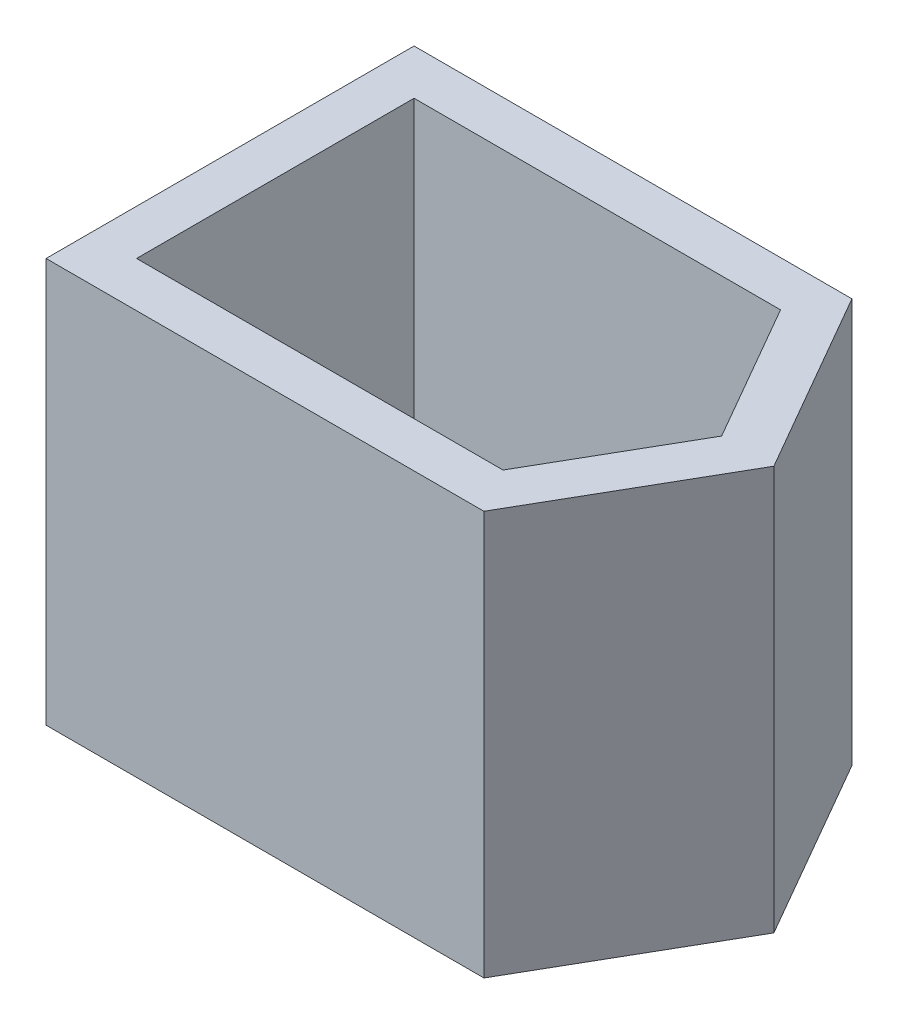
ISO-10303-21;
HEADER;
FILE_DESCRIPTION(('STEP AP214'),'2;1');
FILE_NAME('part.step','',(''),(''),'','','');
FILE_SCHEMA(('AUTOMOTIVE_DESIGN { 1 0 10303 214 1 1 1 1 }'));
ENDSEC;
DATA;
#1=APPLICATION_CONTEXT('core data for automotive mechanical design processes');
#2=APPLICATION_PROTOCOL_DEFINITION('international standard','automotive_design',2000,#1);
#3=PRODUCT_CONTEXT('',#1,'mechanical');
#4=PRODUCT('Part','Part','',(#3));
#5=PRODUCT_RELATED_PRODUCT_CATEGORY('part','',(#4));
#6=PRODUCT_DEFINITION_FORMATION('','',#4);
#7=PRODUCT_DEFINITION_CONTEXT('part definition',#1,'design');
#8=PRODUCT_DEFINITION('design','',#6,#7);
#9=PRODUCT_DEFINITION_SHAPE('','',#8);
#10=(LENGTH_UNIT() NAMED_UNIT(*) SI_UNIT(.MILLI.,.METRE.));
#11=(NAMED_UNIT(*) PLANE_ANGLE_UNIT() SI_UNIT($,.RADIAN.));
#12=(NAMED_UNIT(*) SI_UNIT($,.STERADIAN.) SOLID_ANGLE_UNIT());
#13=UNCERTAINTY_MEASURE_WITH_UNIT(LENGTH_MEASURE(1.E-05),#10,'distance_accuracy_value','');
#14=(GEOMETRIC_REPRESENTATION_CONTEXT(3) GLOBAL_UNCERTAINTY_ASSIGNED_CONTEXT((#13)) GLOBAL_UNIT_ASSIGNED_CONTEXT((#10,
#11,#12)) REPRESENTATION_CONTEXT('',''));
#15=CARTESIAN_POINT('',(0.,0.,0.));
#16=DIRECTION('',(0.,0.,1.));
#17=DIRECTION('',(1.,0.,0.));
#18=AXIS2_PLACEMENT_3D('',#15,#16,#17);
#19=CARTESIAN_POINT('',(0.,67.,0.));
#20=DIRECTION('',(0.,1.,0.));
#21=DIRECTION('',(0.,0.,1.));
#22=AXIS2_PLACEMENT_3D('',#19,#20,#21);
#23=PLANE('',#22);
#24=DIRECTION('',(-0.498868225243293,0.,-0.86667784893962));
#25=VECTOR('',#24,1.);
#26=CARTESIAN_POINT('',(80.1383126639673,67.,-20.5));
#27=LINE('',#26,#25);
#28=CARTESIAN_POINT('',(80.1383126639673,67.,-20.5));
#29=VERTEX_POINT('',#28);
#30=CARTESIAN_POINT('',(62.5822151029917,67.,-51.));
#31=VERTEX_POINT('',#30);
#32=EDGE_CURVE('E176',#29,#31,#27,.T.);
#33=ORIENTED_EDGE('',*,*,#32,.T.);
#34=DIRECTION('',(-1.,0.,0.));
#35=VECTOR('',#34,1.);
#36=CARTESIAN_POINT('',(62.5822151029917,67.,-51.));
#37=LINE('',#36,#35);
#38=CARTESIAN_POINT('',(-10.,67.,-51.));
#39=VERTEX_POINT('',#38);
#40=EDGE_CURVE('E180',#31,#39,#37,.T.);
#41=ORIENTED_EDGE('',*,*,#40,.T.);
#42=DIRECTION('',(0.,0.,1.));
#43=VECTOR('',#42,1.);
#44=CARTESIAN_POINT('',(-10.,67.,-51.));
#45=LINE('',#44,#43);
#46=CARTESIAN_POINT('',(-9.99999999999999,67.,10.));
#47=VERTEX_POINT('',#46);
#48=EDGE_CURVE('E184',#39,#47,#45,.T.);
#49=ORIENTED_EDGE('',*,*,#48,.T.);
#50=DIRECTION('',(1.,0.,0.));
#51=VECTOR('',#50,1.);
#52=CARTESIAN_POINT('',(-9.99999999999999,67.,10.));
#53=LINE('',#52,#51);
#54=CARTESIAN_POINT('',(62.5822151029918,67.,9.99999999999999));
#55=VERTEX_POINT('',#54);
#56=EDGE_CURVE('E187',#47,#55,#53,.T.);
#57=ORIENTED_EDGE('',*,*,#56,.T.);
#58=DIRECTION('',(0.498868225243293,0.,-0.86667784893962));
#59=VECTOR('',#58,1.);
#60=CARTESIAN_POINT('',(62.5822151029918,67.,9.99999999999999));
#61=LINE('',#60,#59);
#62=EDGE_CURVE('E190',#55,#29,#61,.T.);
#63=ORIENTED_EDGE('',*,*,#62,.T.);
#64=EDGE_LOOP('',(#33,#41,#49,#57,#63));
#65=FACE_BOUND('',#64,.T.);
#66=DIRECTION('',(0.,0.,1.));
#67=VECTOR('',#66,1.);
#68=CARTESIAN_POINT('',(-2.5,67.,-43.5));
#69=LINE('',#68,#67);
#70=CARTESIAN_POINT('',(-2.5,67.,-43.5));
#71=VERTEX_POINT('',#70);
#72=CARTESIAN_POINT('',(-2.5,67.,2.5));
#73=VERTEX_POINT('',#72);
#74=EDGE_CURVE('E126',#71,#73,#69,.T.);
#75=ORIENTED_EDGE('',*,*,#74,.F.);
#76=DIRECTION('',(-1.,0.,0.));
#77=VECTOR('',#76,1.);
#78=CARTESIAN_POINT('',(58.2455537757479,67.,-43.5));
#79=LINE('',#78,#77);
#80=CARTESIAN_POINT('',(58.2455537757479,67.,-43.5));
#81=VERTEX_POINT('',#80);
#82=EDGE_CURVE('E117',#81,#71,#79,.T.);
#83=ORIENTED_EDGE('',*,*,#82,.F.);
#84=DIRECTION('',(-0.498868225243293,0.,-0.86667784893962));
#85=VECTOR('',#84,1.);
#86=CARTESIAN_POINT('',(71.4845781659918,67.,-20.5));
#87=LINE('',#86,#85);
#88=CARTESIAN_POINT('',(71.4845781659918,67.,-20.5));
#89=VERTEX_POINT('',#88);
#90=EDGE_CURVE('E149',#89,#81,#87,.T.);
#91=ORIENTED_EDGE('',*,*,#90,.F.);
#92=DIRECTION('',(0.498868225243293,0.,-0.86667784893962));
#93=VECTOR('',#92,1.);
#94=CARTESIAN_POINT('',(58.2455537757479,67.,2.5));
#95=LINE('',#94,#93);
#96=CARTESIAN_POINT('',(58.2455537757479,67.,2.5));
#97=VERTEX_POINT('',#96);
#98=EDGE_CURVE('E144',#97,#89,#95,.T.);
#99=ORIENTED_EDGE('',*,*,#98,.F.);
#100=DIRECTION('',(1.,0.,0.));
#101=VECTOR('',#100,1.);
#102=CARTESIAN_POINT('',(-2.5,67.,2.5));
#103=LINE('',#102,#101);
#104=EDGE_CURVE('E140',#73,#97,#103,.T.);
#105=ORIENTED_EDGE('',*,*,#104,.F.);
#106=EDGE_LOOP('',(#75,#83,#91,#99,#105));
#107=FACE_BOUND('',#106,.T.);
#108=ADVANCED_FACE('F39',(#65,#107),#23,.T.);
#109=CARTESIAN_POINT('',(0.,0.,0.));
#110=DIRECTION('',(0.,1.,0.));
#111=DIRECTION('',(0.,0.,1.));
#112=AXIS2_PLACEMENT_3D('',#109,#110,#111);
#113=PLANE('',#112);
#114=DIRECTION('',(-0.498868225243293,0.,-0.86667784893962));
#115=VECTOR('',#114,1.);
#116=CARTESIAN_POINT('',(80.1383126639673,0.,-20.5));
#117=LINE('',#116,#115);
#118=CARTESIAN_POINT('',(80.1383126639673,0.,-20.5));
#119=VERTEX_POINT('',#118);
#120=CARTESIAN_POINT('',(62.5822151029917,0.,-51.));
#121=VERTEX_POINT('',#120);
#122=EDGE_CURVE('E135',#119,#121,#117,.T.);
#123=ORIENTED_EDGE('',*,*,#122,.F.);
#124=DIRECTION('',(0.498868225243293,0.,-0.86667784893962));
#125=VECTOR('',#124,1.);
#126=CARTESIAN_POINT('',(62.5822151029918,0.,9.99999999999999));
#127=LINE('',#126,#125);
#128=CARTESIAN_POINT('',(62.5822151029918,0.,9.99999999999999));
#129=VERTEX_POINT('',#128);
#130=EDGE_CURVE('E181',#129,#119,#127,.T.);
#131=ORIENTED_EDGE('',*,*,#130,.F.);
#132=DIRECTION('',(1.,0.,0.));
#133=VECTOR('',#132,1.);
#134=CARTESIAN_POINT('',(-9.99999999999999,0.,10.));
#135=LINE('',#134,#133);
#136=CARTESIAN_POINT('',(-9.99999999999999,0.,10.));
#137=VERTEX_POINT('',#136);
#138=EDGE_CURVE('E203',#137,#129,#135,.T.);
#139=ORIENTED_EDGE('',*,*,#138,.F.);
#140=DIRECTION('',(0.,0.,1.));
#141=VECTOR('',#140,1.);
#142=CARTESIAN_POINT('',(-10.,0.,-51.));
#143=LINE('',#142,#141);
#144=CARTESIAN_POINT('',(-10.,0.,-51.));
#145=VERTEX_POINT('',#144);
#146=EDGE_CURVE('E200',#145,#137,#143,.T.);
#147=ORIENTED_EDGE('',*,*,#146,.F.);
#148=DIRECTION('',(-1.,0.,0.));
#149=VECTOR('',#148,1.);
#150=CARTESIAN_POINT('',(62.5822151029917,0.,-51.));
#151=LINE('',#150,#149);
#152=EDGE_CURVE('E197',#121,#145,#151,.T.);
#153=ORIENTED_EDGE('',*,*,#152,.F.);
#154=EDGE_LOOP('',(#123,#131,#139,#147,#153));
#155=FACE_BOUND('',#154,.T.);
#156=DIRECTION('',(-1.,0.,0.));
#157=VECTOR('',#156,1.);
#158=CARTESIAN_POINT('',(58.2455537757479,0.,-43.5));
#159=LINE('',#158,#157);
#160=CARTESIAN_POINT('',(58.2455537757479,0.,-43.5));
#161=VERTEX_POINT('',#160);
#162=CARTESIAN_POINT('',(-2.5,0.,-43.5));
#163=VERTEX_POINT('',#162);
#164=EDGE_CURVE('E63',#161,#163,#159,.T.);
#165=ORIENTED_EDGE('',*,*,#164,.T.);
#166=DIRECTION('',(0.,0.,1.));
#167=VECTOR('',#166,1.);
#168=CARTESIAN_POINT('',(-2.5,0.,-43.5));
#169=LINE('',#168,#167);
#170=CARTESIAN_POINT('',(-2.5,0.,2.5));
#171=VERTEX_POINT('',#170);
#172=EDGE_CURVE('E133',#163,#171,#169,.T.);
#173=ORIENTED_EDGE('',*,*,#172,.T.);
#174=DIRECTION('',(1.,0.,0.));
#175=VECTOR('',#174,1.);
#176=CARTESIAN_POINT('',(-2.5,0.,2.5));
#177=LINE('',#176,#175);
#178=CARTESIAN_POINT('',(58.2455537757479,0.,2.5));
#179=VERTEX_POINT('',#178);
#180=EDGE_CURVE('E156',#171,#179,#177,.T.);
#181=ORIENTED_EDGE('',*,*,#180,.T.);
#182=DIRECTION('',(0.498868225243293,0.,-0.86667784893962));
#183=VECTOR('',#182,1.);
#184=CARTESIAN_POINT('',(58.2455537757479,0.,2.5));
#185=LINE('',#184,#183);
#186=CARTESIAN_POINT('',(71.4845781659918,0.,-20.5));
#187=VERTEX_POINT('',#186);
#188=EDGE_CURVE('E160',#179,#187,#185,.T.);
#189=ORIENTED_EDGE('',*,*,#188,.T.);
#190=DIRECTION('',(-0.498868225243293,0.,-0.86667784893962));
#191=VECTOR('',#190,1.);
#192=CARTESIAN_POINT('',(71.4845781659918,0.,-20.5));
#193=LINE('',#192,#191);
#194=EDGE_CURVE('E127',#187,#161,#193,.T.);
#195=ORIENTED_EDGE('',*,*,#194,.T.);
#196=EDGE_LOOP('',(#165,#173,#181,#189,#195));
#197=FACE_BOUND('',#196,.T.);
#198=ADVANCED_FACE('F230',(#155,#197),#113,.F.);
#199=CARTESIAN_POINT('',(80.1383126639673,67.,-20.5));
#200=DIRECTION('',(-0.86667784893962,0.,0.498868225243293));
#201=DIRECTION('',(0.498868225243293,0.,0.86667784893962));
#202=AXIS2_PLACEMENT_3D('',#199,#200,#201);
#203=PLANE('',#202);
#204=ORIENTED_EDGE('',*,*,#122,.T.);
#205=DIRECTION('',(0.,-1.,0.));
#206=VECTOR('',#205,1.);
#207=CARTESIAN_POINT('',(62.5822151029917,67.,-51.));
#208=LINE('',#207,#206);
#209=EDGE_CURVE('E11',#31,#121,#208,.T.);
#210=ORIENTED_EDGE('',*,*,#209,.F.);
#211=ORIENTED_EDGE('',*,*,#32,.F.);
#212=DIRECTION('',(0.,-1.,0.));
#213=VECTOR('',#212,1.);
#214=CARTESIAN_POINT('',(80.1383126639673,67.,-20.5));
#215=LINE('',#214,#213);
#216=EDGE_CURVE('E193',#29,#119,#215,.T.);
#217=ORIENTED_EDGE('',*,*,#216,.T.);
#218=EDGE_LOOP('',(#204,#210,#211,#217));
#219=FACE_BOUND('',#218,.T.);
#220=ADVANCED_FACE('F41',(#219),#203,.F.);
#221=CARTESIAN_POINT('',(62.5822151029917,67.,-51.));
#222=DIRECTION('',(0.,0.,1.));
#223=DIRECTION('',(1.,0.,0.));
#224=AXIS2_PLACEMENT_3D('',#221,#222,#223);
#225=PLANE('',#224);
#226=ORIENTED_EDGE('',*,*,#152,.T.);
#227=DIRECTION('',(0.,-1.,0.));
#228=VECTOR('',#227,1.);
#229=CARTESIAN_POINT('',(-10.,67.,-51.));
#230=LINE('',#229,#228);
#231=EDGE_CURVE('E48',#39,#145,#230,.T.);
#232=ORIENTED_EDGE('',*,*,#231,.F.);
#233=ORIENTED_EDGE('',*,*,#40,.F.);
#234=ORIENTED_EDGE('',*,*,#209,.T.);
#235=EDGE_LOOP('',(#226,#232,#233,#234));
#236=FACE_BOUND('',#235,.T.);
#237=ADVANCED_FACE('F244',(#236),#225,.F.);
#238=CARTESIAN_POINT('',(-10.,67.,-51.));
#239=DIRECTION('',(1.,0.,0.));
#240=DIRECTION('',(0.,0.,-1.));
#241=AXIS2_PLACEMENT_3D('',#238,#239,#240);
#242=PLANE('',#241);
#243=ORIENTED_EDGE('',*,*,#146,.T.);
#244=DIRECTION('',(0.,-1.,0.));
#245=VECTOR('',#244,1.);
#246=CARTESIAN_POINT('',(-9.99999999999999,67.,10.));
#247=LINE('',#246,#245);
#248=EDGE_CURVE('E215',#47,#137,#247,.T.);
#249=ORIENTED_EDGE('',*,*,#248,.F.);
#250=ORIENTED_EDGE('',*,*,#48,.F.);
#251=ORIENTED_EDGE('',*,*,#231,.T.);
#252=EDGE_LOOP('',(#243,#249,#250,#251));
#253=FACE_BOUND('',#252,.T.);
#254=ADVANCED_FACE('F224',(#253),#242,.F.);
#255=CARTESIAN_POINT('',(-9.99999999999999,67.,10.));
#256=DIRECTION('',(0.,0.,-1.));
#257=DIRECTION('',(-1.,0.,0.));
#258=AXIS2_PLACEMENT_3D('',#255,#256,#257);
#259=PLANE('',#258);
#260=ORIENTED_EDGE('',*,*,#138,.T.);
#261=DIRECTION('',(0.,-1.,0.));
#262=VECTOR('',#261,1.);
#263=CARTESIAN_POINT('',(62.5822151029918,67.,9.99999999999999));
#264=LINE('',#263,#262);
#265=EDGE_CURVE('E211',#55,#129,#264,.T.);
#266=ORIENTED_EDGE('',*,*,#265,.F.);
#267=ORIENTED_EDGE('',*,*,#56,.F.);
#268=ORIENTED_EDGE('',*,*,#248,.T.);
#269=EDGE_LOOP('',(#260,#266,#267,#268));
#270=FACE_BOUND('',#269,.T.);
#271=ADVANCED_FACE('F235',(#270),#259,.F.);
#272=CARTESIAN_POINT('',(62.5822151029918,67.,9.99999999999999));
#273=DIRECTION('',(-0.86667784893962,0.,-0.498868225243293));
#274=DIRECTION('',(-0.498868225243293,0.,0.86667784893962));
#275=AXIS2_PLACEMENT_3D('',#272,#273,#274);
#276=PLANE('',#275);
#277=ORIENTED_EDGE('',*,*,#130,.T.);
#278=ORIENTED_EDGE('',*,*,#216,.F.);
#279=ORIENTED_EDGE('',*,*,#62,.F.);
#280=ORIENTED_EDGE('',*,*,#265,.T.);
#281=EDGE_LOOP('',(#277,#278,#279,#280));
#282=FACE_BOUND('',#281,.T.);
#283=ADVANCED_FACE('F239',(#282),#276,.F.);
#284=CARTESIAN_POINT('',(58.2455537757479,67.,-43.5));
#285=DIRECTION('',(0.,0.,1.));
#286=DIRECTION('',(1.,0.,0.));
#287=AXIS2_PLACEMENT_3D('',#284,#285,#286);
#288=PLANE('',#287);
#289=ORIENTED_EDGE('',*,*,#164,.F.);
#290=DIRECTION('',(0.,-1.,0.));
#291=VECTOR('',#290,1.);
#292=CARTESIAN_POINT('',(58.2455537757479,67.,-43.5));
#293=LINE('',#292,#291);
#294=EDGE_CURVE('E121',#81,#161,#293,.T.);
#295=ORIENTED_EDGE('',*,*,#294,.F.);
#296=ORIENTED_EDGE('',*,*,#82,.T.);
#297=DIRECTION('',(0.,-1.,0.));
#298=VECTOR('',#297,1.);
#299=CARTESIAN_POINT('',(-2.5,67.,-43.5));
#300=LINE('',#299,#298);
#301=EDGE_CURVE('E120',#71,#163,#300,.T.);
#302=ORIENTED_EDGE('',*,*,#301,.T.);
#303=EDGE_LOOP('',(#289,#295,#296,#302));
#304=FACE_BOUND('',#303,.T.);
#305=ADVANCED_FACE('F119',(#304),#288,.T.);
#306=CARTESIAN_POINT('',(-2.5,67.,-43.5));
#307=DIRECTION('',(1.,0.,0.));
#308=DIRECTION('',(0.,0.,-1.));
#309=AXIS2_PLACEMENT_3D('',#306,#307,#308);
#310=PLANE('',#309);
#311=ORIENTED_EDGE('',*,*,#172,.F.);
#312=ORIENTED_EDGE('',*,*,#301,.F.);
#313=ORIENTED_EDGE('',*,*,#74,.T.);
#314=DIRECTION('',(0.,-1.,0.));
#315=VECTOR('',#314,1.);
#316=CARTESIAN_POINT('',(-2.5,67.,2.5));
#317=LINE('',#316,#315);
#318=EDGE_CURVE('E136',#73,#171,#317,.T.);
#319=ORIENTED_EDGE('',*,*,#318,.T.);
#320=EDGE_LOOP('',(#311,#312,#313,#319));
#321=FACE_BOUND('',#320,.T.);
#322=ADVANCED_FACE('F130',(#321),#310,.T.);
#323=CARTESIAN_POINT('',(-2.5,67.,2.5));
#324=DIRECTION('',(0.,0.,-1.));
#325=DIRECTION('',(-1.,0.,0.));
#326=AXIS2_PLACEMENT_3D('',#323,#324,#325);
#327=PLANE('',#326);
#328=ORIENTED_EDGE('',*,*,#180,.F.);
#329=ORIENTED_EDGE('',*,*,#318,.F.);
#330=ORIENTED_EDGE('',*,*,#104,.T.);
#331=DIRECTION('',(0.,-1.,0.));
#332=VECTOR('',#331,1.);
#333=CARTESIAN_POINT('',(58.2455537757479,67.,2.5));
#334=LINE('',#333,#332);
#335=EDGE_CURVE('E171',#97,#179,#334,.T.);
#336=ORIENTED_EDGE('',*,*,#335,.T.);
#337=EDGE_LOOP('',(#328,#329,#330,#336));
#338=FACE_BOUND('',#337,.T.);
#339=ADVANCED_FACE('F287',(#338),#327,.T.);
#340=CARTESIAN_POINT('',(58.2455537757479,67.,2.5));
#341=DIRECTION('',(-0.86667784893962,0.,-0.498868225243293));
#342=DIRECTION('',(-0.498868225243293,0.,0.86667784893962));
#343=AXIS2_PLACEMENT_3D('',#340,#341,#342);
#344=PLANE('',#343);
#345=ORIENTED_EDGE('',*,*,#188,.F.);
#346=ORIENTED_EDGE('',*,*,#335,.F.);
#347=ORIENTED_EDGE('',*,*,#98,.T.);
#348=DIRECTION('',(0.,-1.,0.));
#349=VECTOR('',#348,1.);
#350=CARTESIAN_POINT('',(71.4845781659918,67.,-20.5));
#351=LINE('',#350,#349);
#352=EDGE_CURVE('E55',#89,#187,#351,.T.);
#353=ORIENTED_EDGE('',*,*,#352,.T.);
#354=EDGE_LOOP('',(#345,#346,#347,#353));
#355=FACE_BOUND('',#354,.T.);
#356=ADVANCED_FACE('F293',(#355),#344,.T.);
#357=CARTESIAN_POINT('',(71.4845781659918,67.,-20.5));
#358=DIRECTION('',(-0.86667784893962,0.,0.498868225243293));
#359=DIRECTION('',(0.498868225243293,0.,0.86667784893962));
#360=AXIS2_PLACEMENT_3D('',#357,#358,#359);
#361=PLANE('',#360);
#362=ORIENTED_EDGE('',*,*,#194,.F.);
#363=ORIENTED_EDGE('',*,*,#352,.F.);
#364=ORIENTED_EDGE('',*,*,#90,.T.);
#365=ORIENTED_EDGE('',*,*,#294,.T.);
#366=EDGE_LOOP('',(#362,#363,#364,#365));
#367=FACE_BOUND('',#366,.T.);
#368=ADVANCED_FACE('F301',(#367),#361,.T.);
#369=CLOSED_SHELL('',(#108,#198,#220,#237,#254,#271,#283,#305,#322,#339,#356,#368));
#370=MANIFOLD_SOLID_BREP('B2',#369);
#371=ADVANCED_BREP_SHAPE_REPRESENTATION('',(#18,#370),#14);
#372=SHAPE_DEFINITION_REPRESENTATION(#9,#371);
ENDSEC;
END-ISO-10303-21;
